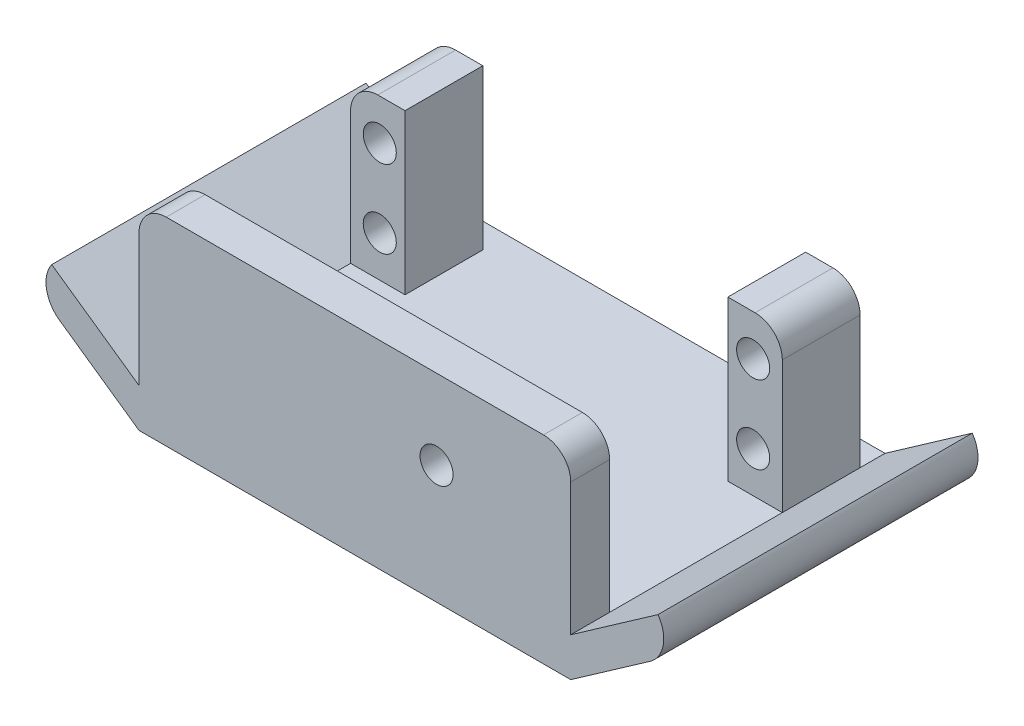
ISO-10303-21;
HEADER;
FILE_DESCRIPTION(('STEP AP214'),'2;1');
FILE_NAME('part.step','',(''),(''),'','','');
FILE_SCHEMA(('AUTOMOTIVE_DESIGN { 1 0 10303 214 1 1 1 1 }'));
ENDSEC;
DATA;
#1=APPLICATION_CONTEXT('core data for automotive mechanical design processes');
#2=APPLICATION_PROTOCOL_DEFINITION('international standard','automotive_design',2000,#1);
#3=PRODUCT_CONTEXT('',#1,'mechanical');
#4=PRODUCT('Part','Part','',(#3));
#5=PRODUCT_RELATED_PRODUCT_CATEGORY('part','',(#4));
#6=PRODUCT_DEFINITION_FORMATION('','',#4);
#7=PRODUCT_DEFINITION_CONTEXT('part definition',#1,'design');
#8=PRODUCT_DEFINITION('design','',#6,#7);
#9=PRODUCT_DEFINITION_SHAPE('','',#8);
#10=(LENGTH_UNIT() NAMED_UNIT(*) SI_UNIT(.MILLI.,.METRE.));
#11=(NAMED_UNIT(*) PLANE_ANGLE_UNIT() SI_UNIT($,.RADIAN.));
#12=(NAMED_UNIT(*) SI_UNIT($,.STERADIAN.) SOLID_ANGLE_UNIT());
#13=UNCERTAINTY_MEASURE_WITH_UNIT(LENGTH_MEASURE(1.E-05),#10,'distance_accuracy_value','');
#14=(GEOMETRIC_REPRESENTATION_CONTEXT(3) GLOBAL_UNCERTAINTY_ASSIGNED_CONTEXT((#13)) GLOBAL_UNIT_ASSIGNED_CONTEXT((#10,
#11,#12)) REPRESENTATION_CONTEXT('',''));
#15=CARTESIAN_POINT('',(0.,0.,0.));
#16=DIRECTION('',(0.,0.,1.));
#17=DIRECTION('',(1.,0.,0.));
#18=AXIS2_PLACEMENT_3D('',#15,#16,#17);
#19=CARTESIAN_POINT('',(55.5,5.,0.));
#20=DIRECTION('',(1.,0.,0.));
#21=DIRECTION('',(0.,0.,-1.));
#22=AXIS2_PLACEMENT_3D('',#19,#20,#21);
#23=PLANE('',#22);
#24=DIRECTION('',(0.,-1.,0.));
#25=VECTOR('',#24,1.);
#26=CARTESIAN_POINT('',(55.5,0.,35.4));
#27=LINE('',#26,#25);
#28=CARTESIAN_POINT('',(55.5,22.,35.4));
#29=VERTEX_POINT('',#28);
#30=CARTESIAN_POINT('',(55.5,5.,35.4));
#31=VERTEX_POINT('',#30);
#32=EDGE_CURVE('E379',#29,#31,#27,.T.);
#33=ORIENTED_EDGE('',*,*,#32,.F.);
#34=DIRECTION('',(0.,0.,1.));
#35=VECTOR('',#34,1.);
#36=CARTESIAN_POINT('',(55.5,22.,40.4));
#37=LINE('',#36,#35);
#38=CARTESIAN_POINT('',(55.5,22.,40.4));
#39=VERTEX_POINT('',#38);
#40=EDGE_CURVE('E435',#29,#39,#37,.T.);
#41=ORIENTED_EDGE('',*,*,#40,.T.);
#42=DIRECTION('',(0.,-1.,0.));
#43=VECTOR('',#42,1.);
#44=CARTESIAN_POINT('',(55.5,5.,40.4));
#45=LINE('',#44,#43);
#46=CARTESIAN_POINT('',(55.5,5.,40.4));
#47=VERTEX_POINT('',#46);
#48=EDGE_CURVE('E405',#39,#47,#45,.T.);
#49=ORIENTED_EDGE('',*,*,#48,.T.);
#50=DIRECTION('',(0.,0.,-1.));
#51=VECTOR('',#50,1.);
#52=CARTESIAN_POINT('',(55.5,5.,57.9564078321223));
#53=LINE('',#52,#51);
#54=EDGE_CURVE('E307',#47,#31,#53,.T.);
#55=ORIENTED_EDGE('',*,*,#54,.T.);
#56=EDGE_LOOP('',(#33,#41,#49,#55));
#57=FACE_BOUND('',#56,.T.);
#58=ADVANCED_FACE('F39',(#57),#23,.T.);
#59=DIRECTION('',(0.,1.,0.));
#60=VECTOR('',#59,1.);
#61=CARTESIAN_POINT('',(55.5,25.5,3.2));
#62=LINE('',#61,#60);
#63=CARTESIAN_POINT('',(55.5,5.,3.2));
#64=VERTEX_POINT('',#63);
#65=CARTESIAN_POINT('',(55.5,22.,3.2));
#66=VERTEX_POINT('',#65);
#67=EDGE_CURVE('E203',#64,#66,#62,.T.);
#68=ORIENTED_EDGE('',*,*,#67,.T.);
#69=DIRECTION('',(0.,0.,1.));
#70=VECTOR('',#69,1.);
#71=CARTESIAN_POINT('',(55.5,22.,0.));
#72=LINE('',#71,#70);
#73=CARTESIAN_POINT('',(55.5,22.,13.2));
#74=VERTEX_POINT('',#73);
#75=EDGE_CURVE('E197',#66,#74,#72,.T.);
#76=ORIENTED_EDGE('',*,*,#75,.T.);
#77=DIRECTION('',(0.,1.,0.));
#78=VECTOR('',#77,1.);
#79=CARTESIAN_POINT('',(55.5,5.,13.2));
#80=LINE('',#79,#78);
#81=CARTESIAN_POINT('',(55.5,5.,13.2));
#82=VERTEX_POINT('',#81);
#83=EDGE_CURVE('E200',#82,#74,#80,.T.);
#84=ORIENTED_EDGE('',*,*,#83,.F.);
#85=DIRECTION('',(0.,0.,1.));
#86=VECTOR('',#85,1.);
#87=CARTESIAN_POINT('',(55.5,5.,0.));
#88=LINE('',#87,#86);
#89=EDGE_CURVE('E402',#64,#82,#88,.T.);
#90=ORIENTED_EDGE('',*,*,#89,.F.);
#91=EDGE_LOOP('',(#68,#76,#84,#90));
#92=FACE_BOUND('',#91,.T.);
#93=ADVANCED_FACE('F199',(#92),#23,.T.);
#94=CARTESIAN_POINT('',(0.,5.,0.));
#95=DIRECTION('',(-1.,0.,0.));
#96=DIRECTION('',(0.,0.,1.));
#97=AXIS2_PLACEMENT_3D('',#94,#95,#96);
#98=PLANE('',#97);
#99=DIRECTION('',(0.,0.,-1.));
#100=VECTOR('',#99,1.);
#101=CARTESIAN_POINT('',(0.,5.,57.9564078321223));
#102=LINE('',#101,#100);
#103=CARTESIAN_POINT('',(0.,5.,13.2));
#104=VERTEX_POINT('',#103);
#105=CARTESIAN_POINT('',(0.,5.,3.2));
#106=VERTEX_POINT('',#105);
#107=EDGE_CURVE('E317',#104,#106,#102,.T.);
#108=ORIENTED_EDGE('',*,*,#107,.F.);
#109=DIRECTION('',(0.,-1.,0.));
#110=VECTOR('',#109,1.);
#111=CARTESIAN_POINT('',(0.,22.,13.2));
#112=LINE('',#111,#110);
#113=CARTESIAN_POINT('',(0.,22.,13.2));
#114=VERTEX_POINT('',#113);
#115=EDGE_CURVE('E253',#114,#104,#112,.T.);
#116=ORIENTED_EDGE('',*,*,#115,.F.);
#117=DIRECTION('',(0.,0.,1.));
#118=VECTOR('',#117,1.);
#119=CARTESIAN_POINT('',(0.,22.,0.));
#120=LINE('',#119,#118);
#121=CARTESIAN_POINT('',(0.,22.,3.2));
#122=VERTEX_POINT('',#121);
#123=EDGE_CURVE('E473',#114,#122,#120,.F.);
#124=ORIENTED_EDGE('',*,*,#123,.T.);
#125=DIRECTION('',(0.,-1.,0.));
#126=VECTOR('',#125,1.);
#127=CARTESIAN_POINT('',(0.,25.5,3.2));
#128=LINE('',#127,#126);
#129=EDGE_CURVE('E356',#122,#106,#128,.T.);
#130=ORIENTED_EDGE('',*,*,#129,.T.);
#131=EDGE_LOOP('',(#108,#116,#124,#130));
#132=FACE_BOUND('',#131,.T.);
#133=ADVANCED_FACE('F494',(#132),#98,.T.);
#134=DIRECTION('',(0.,-1.,0.));
#135=VECTOR('',#134,1.);
#136=CARTESIAN_POINT('',(0.,5.,40.4));
#137=LINE('',#136,#135);
#138=CARTESIAN_POINT('',(0.,22.,40.4));
#139=VERTEX_POINT('',#138);
#140=CARTESIAN_POINT('',(0.,5.,40.4));
#141=VERTEX_POINT('',#140);
#142=EDGE_CURVE('E411',#139,#141,#137,.T.);
#143=ORIENTED_EDGE('',*,*,#142,.F.);
#144=DIRECTION('',(0.,0.,1.));
#145=VECTOR('',#144,1.);
#146=CARTESIAN_POINT('',(0.,22.,35.4));
#147=LINE('',#146,#145);
#148=CARTESIAN_POINT('',(0.,22.,35.4));
#149=VERTEX_POINT('',#148);
#150=EDGE_CURVE('E467',#139,#149,#147,.F.);
#151=ORIENTED_EDGE('',*,*,#150,.T.);
#152=DIRECTION('',(0.,1.,0.));
#153=VECTOR('',#152,1.);
#154=CARTESIAN_POINT('',(0.,0.,35.4));
#155=LINE('',#154,#153);
#156=CARTESIAN_POINT('',(0.,5.,35.4));
#157=VERTEX_POINT('',#156);
#158=EDGE_CURVE('E387',#157,#149,#155,.T.);
#159=ORIENTED_EDGE('',*,*,#158,.F.);
#160=EDGE_CURVE('E333',#141,#157,#102,.T.);
#161=ORIENTED_EDGE('',*,*,#160,.F.);
#162=EDGE_LOOP('',(#143,#151,#159,#161));
#163=FACE_BOUND('',#162,.T.);
#164=ADVANCED_FACE('F515',(#163),#98,.T.);
#165=CARTESIAN_POINT('',(0.,5.,0.));
#166=DIRECTION('',(0.,-1.,0.));
#167=DIRECTION('',(0.,0.,-1.));
#168=AXIS2_PLACEMENT_3D('',#165,#166,#167);
#169=PLANE('',#168);
#170=EDGE_CURVE('E62',#82,#31,#88,.T.);
#171=ORIENTED_EDGE('',*,*,#170,.F.);
#172=DIRECTION('',(1.,0.,0.));
#173=VECTOR('',#172,1.);
#174=CARTESIAN_POINT('',(48.5,5.,13.2));
#175=LINE('',#174,#173);
#176=CARTESIAN_POINT('',(48.5,5.,13.2));
#177=VERTEX_POINT('',#176);
#178=EDGE_CURVE('E219',#177,#82,#175,.T.);
#179=ORIENTED_EDGE('',*,*,#178,.F.);
#180=DIRECTION('',(0.,0.,1.));
#181=VECTOR('',#180,1.);
#182=CARTESIAN_POINT('',(48.5,5.,3.2));
#183=LINE('',#182,#181);
#184=CARTESIAN_POINT('',(48.5,5.,3.2));
#185=VERTEX_POINT('',#184);
#186=EDGE_CURVE('E55',#185,#177,#183,.T.);
#187=ORIENTED_EDGE('',*,*,#186,.F.);
#188=DIRECTION('',(1.,0.,0.));
#189=VECTOR('',#188,1.);
#190=CARTESIAN_POINT('',(55.5,5.,3.2));
#191=LINE('',#190,#189);
#192=EDGE_CURVE('E341',#185,#64,#191,.T.);
#193=ORIENTED_EDGE('',*,*,#192,.T.);
#194=DIRECTION('',(0.,0.,-1.));
#195=VECTOR('',#194,1.);
#196=CARTESIAN_POINT('',(55.5,5.,0.));
#197=LINE('',#196,#195);
#198=CARTESIAN_POINT('',(55.5,5.,0.));
#199=VERTEX_POINT('',#198);
#200=EDGE_CURVE('E430',#64,#199,#197,.T.);
#201=ORIENTED_EDGE('',*,*,#200,.T.);
#202=DIRECTION('',(-1.,0.,0.));
#203=VECTOR('',#202,1.);
#204=CARTESIAN_POINT('',(0.,5.,0.));
#205=LINE('',#204,#203);
#206=CARTESIAN_POINT('',(0.,5.,0.));
#207=VERTEX_POINT('',#206);
#208=EDGE_CURVE('E270',#199,#207,#205,.T.);
#209=ORIENTED_EDGE('',*,*,#208,.T.);
#210=DIRECTION('',(0.,0.,1.));
#211=VECTOR('',#210,1.);
#212=CARTESIAN_POINT('',(0.,5.,0.));
#213=LINE('',#212,#211);
#214=EDGE_CURVE('E427',#207,#106,#213,.T.);
#215=ORIENTED_EDGE('',*,*,#214,.T.);
#216=DIRECTION('',(1.,0.,0.));
#217=VECTOR('',#216,1.);
#218=CARTESIAN_POINT('',(0.,5.,3.2));
#219=LINE('',#218,#217);
#220=CARTESIAN_POINT('',(7.,5.,3.2));
#221=VERTEX_POINT('',#220);
#222=EDGE_CURVE('E368',#106,#221,#219,.T.);
#223=ORIENTED_EDGE('',*,*,#222,.T.);
#224=DIRECTION('',(0.,0.,1.));
#225=VECTOR('',#224,1.);
#226=CARTESIAN_POINT('',(7.,5.,3.2));
#227=LINE('',#226,#225);
#228=CARTESIAN_POINT('',(7.,5.,13.2));
#229=VERTEX_POINT('',#228);
#230=EDGE_CURVE('E372',#221,#229,#227,.T.);
#231=ORIENTED_EDGE('',*,*,#230,.T.);
#232=DIRECTION('',(1.,0.,0.));
#233=VECTOR('',#232,1.);
#234=CARTESIAN_POINT('',(0.,5.,13.2));
#235=LINE('',#234,#233);
#236=EDGE_CURVE('E257',#104,#229,#235,.T.);
#237=ORIENTED_EDGE('',*,*,#236,.F.);
#238=DIRECTION('',(0.,0.,-1.));
#239=VECTOR('',#238,1.);
#240=CARTESIAN_POINT('',(0.,5.,0.));
#241=LINE('',#240,#239);
#242=EDGE_CURVE('E398',#157,#104,#241,.T.);
#243=ORIENTED_EDGE('',*,*,#242,.F.);
#244=DIRECTION('',(1.,0.,0.));
#245=VECTOR('',#244,1.);
#246=CARTESIAN_POINT('',(0.,5.,35.4));
#247=LINE('',#246,#245);
#248=EDGE_CURVE('E391',#157,#31,#247,.T.);
#249=ORIENTED_EDGE('',*,*,#248,.T.);
#250=EDGE_LOOP('',(#171,#179,#187,#193,#201,#209,#215,#223,#231,#237,#243,#249));
#251=FACE_BOUND('',#250,.T.);
#252=ADVANCED_FACE('F501',(#251),#169,.F.);
#253=CARTESIAN_POINT('',(0.,0.,0.));
#254=DIRECTION('',(0.,-1.,0.));
#255=DIRECTION('',(0.,0.,-1.));
#256=AXIS2_PLACEMENT_3D('',#253,#254,#255);
#257=PLANE('',#256);
#258=DIRECTION('',(-1.,0.,0.));
#259=VECTOR('',#258,1.);
#260=CARTESIAN_POINT('',(0.,0.,0.));
#261=LINE('',#260,#259);
#262=CARTESIAN_POINT('',(55.5,0.,0.));
#263=VERTEX_POINT('',#262);
#264=CARTESIAN_POINT('',(0.,0.,0.));
#265=VERTEX_POINT('',#264);
#266=EDGE_CURVE('E267',#263,#265,#261,.T.);
#267=ORIENTED_EDGE('',*,*,#266,.F.);
#268=DIRECTION('',(0.,0.,-1.));
#269=VECTOR('',#268,1.);
#270=CARTESIAN_POINT('',(55.5,0.,0.));
#271=LINE('',#270,#269);
#272=CARTESIAN_POINT('',(55.5,0.,40.4));
#273=VERTEX_POINT('',#272);
#274=EDGE_CURVE('E431',#273,#263,#271,.T.);
#275=ORIENTED_EDGE('',*,*,#274,.F.);
#276=DIRECTION('',(-1.,0.,0.));
#277=VECTOR('',#276,1.);
#278=CARTESIAN_POINT('',(0.,0.,40.4));
#279=LINE('',#278,#277);
#280=CARTESIAN_POINT('',(0.,0.,40.4));
#281=VERTEX_POINT('',#280);
#282=EDGE_CURVE('E397',#273,#281,#279,.T.);
#283=ORIENTED_EDGE('',*,*,#282,.T.);
#284=DIRECTION('',(0.,0.,1.));
#285=VECTOR('',#284,1.);
#286=CARTESIAN_POINT('',(0.,0.,0.));
#287=LINE('',#286,#285);
#288=EDGE_CURVE('E424',#265,#281,#287,.T.);
#289=ORIENTED_EDGE('',*,*,#288,.F.);
#290=EDGE_LOOP('',(#267,#275,#283,#289));
#291=FACE_BOUND('',#290,.T.);
#292=ADVANCED_FACE('F587',(#291),#257,.T.);
#293=CARTESIAN_POINT('',(0.,0.,-57.9564078321223));
#294=DIRECTION('',(-0.573576436351041,-0.819152044288995,0.));
#295=DIRECTION('',(0.819152044288995,-0.573576436351041,0.));
#296=AXIS2_PLACEMENT_3D('',#293,#294,#295);
#297=PLANE('',#296);
#298=DIRECTION('',(-0.819152044288995,0.573576436351041,0.));
#299=VECTOR('',#298,1.);
#300=CARTESIAN_POINT('',(0.,0.,0.));
#301=LINE('',#300,#299);
#302=CARTESIAN_POINT('',(-10.2088844777185,7.14833786801052,0.));
#303=VERTEX_POINT('',#302);
#304=EDGE_CURVE('E280',#265,#303,#301,.T.);
#305=ORIENTED_EDGE('',*,*,#304,.F.);
#306=ORIENTED_EDGE('',*,*,#288,.T.);
#307=DIRECTION('',(-0.819152044288995,0.573576436351041,0.));
#308=VECTOR('',#307,1.);
#309=CARTESIAN_POINT('',(0.,0.,40.4));
#310=LINE('',#309,#308);
#311=CARTESIAN_POINT('',(-10.2088844777185,7.14833786801052,40.4));
#312=VERTEX_POINT('',#311);
#313=EDGE_CURVE('E329',#281,#312,#310,.T.);
#314=ORIENTED_EDGE('',*,*,#313,.T.);
#315=DIRECTION('',(0.,0.,1.));
#316=VECTOR('',#315,1.);
#317=CARTESIAN_POINT('',(-10.2088844777185,7.14833786801052,-57.9564078321223));
#318=LINE('',#317,#316);
#319=EDGE_CURVE('E421',#303,#312,#318,.T.);
#320=ORIENTED_EDGE('',*,*,#319,.F.);
#321=EDGE_LOOP('',(#305,#306,#314,#320));
#322=FACE_BOUND('',#321,.T.);
#323=ADVANCED_FACE('F583',(#322),#297,.T.);
#324=CARTESIAN_POINT('',(-7.85722108643022,10.5068612528074,-57.9564078321223));
#325=DIRECTION('',(0.,0.,1.));
#326=DIRECTION('',(1.,0.,0.));
#327=AXIS2_PLACEMENT_3D('',#324,#325,#326);
#328=CYLINDRICAL_SURFACE('',#327,4.10000000392109);
#329=CARTESIAN_POINT('',(-7.85722108643022,10.5068612528074,0.));
#330=DIRECTION('',(0.,0.,1.));
#331=DIRECTION('',(1.,0.,0.));
#332=AXIS2_PLACEMENT_3D('',#329,#330,#331);
#333=CIRCLE('',#332,4.10000000392109);
#334=CARTESIAN_POINT('',(-11.2181745148335,12.8550503602383,0.));
#335=VERTEX_POINT('',#334);
#336=EDGE_CURVE('E277',#303,#335,#333,.F.);
#337=ORIENTED_EDGE('',*,*,#336,.F.);
#338=ORIENTED_EDGE('',*,*,#319,.T.);
#339=CARTESIAN_POINT('',(-7.85722108643022,10.5068612528074,40.4));
#340=DIRECTION('',(0.,0.,-1.));
#341=DIRECTION('',(-1.,0.,0.));
#342=AXIS2_PLACEMENT_3D('',#339,#340,#341);
#343=CIRCLE('',#342,4.10000000392109);
#344=CARTESIAN_POINT('',(-11.2181745148335,12.8550503602383,40.4));
#345=VERTEX_POINT('',#344);
#346=EDGE_CURVE('E324',#312,#345,#343,.T.);
#347=ORIENTED_EDGE('',*,*,#346,.T.);
#348=DIRECTION('',(0.,0.,1.));
#349=VECTOR('',#348,1.);
#350=CARTESIAN_POINT('',(-11.2181745148335,12.8550503602383,-57.9564078321223));
#351=LINE('',#350,#349);
#352=EDGE_CURVE('E418',#335,#345,#351,.T.);
#353=ORIENTED_EDGE('',*,*,#352,.F.);
#354=EDGE_LOOP('',(#337,#338,#347,#353));
#355=FACE_BOUND('',#354,.T.);
#356=ADVANCED_FACE('F586',(#355),#328,.T.);
#357=CARTESIAN_POINT('',(0.,5.,-57.9564078321223));
#358=DIRECTION('',(0.573576436351041,0.819152044288995,0.));
#359=DIRECTION('',(-0.819152044288995,0.573576436351041,0.));
#360=AXIS2_PLACEMENT_3D('',#357,#358,#359);
#361=PLANE('',#360);
#362=DIRECTION('',(0.819152044288995,-0.573576436351041,0.));
#363=VECTOR('',#362,1.);
#364=CARTESIAN_POINT('',(0.,5.,0.));
#365=LINE('',#364,#363);
#366=EDGE_CURVE('E274',#335,#207,#365,.T.);
#367=ORIENTED_EDGE('',*,*,#366,.F.);
#368=ORIENTED_EDGE('',*,*,#352,.T.);
#369=DIRECTION('',(0.819152044288995,-0.573576436351041,0.));
#370=VECTOR('',#369,1.);
#371=CARTESIAN_POINT('',(0.,5.,40.4));
#372=LINE('',#371,#370);
#373=EDGE_CURVE('E328',#345,#141,#372,.T.);
#374=ORIENTED_EDGE('',*,*,#373,.T.);
#375=ORIENTED_EDGE('',*,*,#160,.T.);
#376=ORIENTED_EDGE('',*,*,#242,.T.);
#377=ORIENTED_EDGE('',*,*,#107,.T.);
#378=ORIENTED_EDGE('',*,*,#214,.F.);
#379=EDGE_LOOP('',(#367,#368,#374,#375,#376,#377,#378));
#380=FACE_BOUND('',#379,.T.);
#381=ADVANCED_FACE('F504',(#380),#361,.T.);
#382=CARTESIAN_POINT('',(55.5,5.,-57.9564078321223));
#383=DIRECTION('',(-0.573576436351041,0.819152044288995,0.));
#384=DIRECTION('',(-0.819152044288995,-0.573576436351041,0.));
#385=AXIS2_PLACEMENT_3D('',#382,#383,#384);
#386=PLANE('',#385);
#387=DIRECTION('',(0.819152044288995,0.573576436351041,0.));
#388=VECTOR('',#387,1.);
#389=CARTESIAN_POINT('',(55.5,5.,0.));
#390=LINE('',#389,#388);
#391=CARTESIAN_POINT('',(66.7181745148335,12.8550503602383,0.));
#392=VERTEX_POINT('',#391);
#393=EDGE_CURVE('E264',#199,#392,#390,.T.);
#394=ORIENTED_EDGE('',*,*,#393,.F.);
#395=ORIENTED_EDGE('',*,*,#200,.F.);
#396=ORIENTED_EDGE('',*,*,#89,.T.);
#397=ORIENTED_EDGE('',*,*,#170,.T.);
#398=ORIENTED_EDGE('',*,*,#54,.F.);
#399=DIRECTION('',(0.819152044288995,0.573576436351041,0.));
#400=VECTOR('',#399,1.);
#401=CARTESIAN_POINT('',(55.5,5.,40.4));
#402=LINE('',#401,#400);
#403=CARTESIAN_POINT('',(66.7181745148335,12.8550503602383,40.4));
#404=VERTEX_POINT('',#403);
#405=EDGE_CURVE('E313',#47,#404,#402,.T.);
#406=ORIENTED_EDGE('',*,*,#405,.T.);
#407=DIRECTION('',(0.,0.,1.));
#408=VECTOR('',#407,1.);
#409=CARTESIAN_POINT('',(66.7181745148335,12.8550503602383,-57.9564078321223));
#410=LINE('',#409,#408);
#411=EDGE_CURVE('E415',#392,#404,#410,.T.);
#412=ORIENTED_EDGE('',*,*,#411,.F.);
#413=EDGE_LOOP('',(#394,#395,#396,#397,#398,#406,#412));
#414=FACE_BOUND('',#413,.T.);
#415=ADVANCED_FACE('F535',(#414),#386,.T.);
#416=CARTESIAN_POINT('',(63.3572210864302,10.5068612528074,-57.9564078321223));
#417=DIRECTION('',(0.,0.,1.));
#418=DIRECTION('',(1.,0.,0.));
#419=AXIS2_PLACEMENT_3D('',#416,#417,#418);
#420=CYLINDRICAL_SURFACE('',#419,4.10000000392109);
#421=CARTESIAN_POINT('',(63.3572210864302,10.5068612528074,0.));
#422=DIRECTION('',(0.,0.,1.));
#423=DIRECTION('',(1.,0.,0.));
#424=AXIS2_PLACEMENT_3D('',#421,#422,#423);
#425=CIRCLE('',#424,4.10000000392109);
#426=CARTESIAN_POINT('',(65.7088844777185,7.14833786801052,0.));
#427=VERTEX_POINT('',#426);
#428=EDGE_CURVE('E261',#392,#427,#425,.F.);
#429=ORIENTED_EDGE('',*,*,#428,.F.);
#430=ORIENTED_EDGE('',*,*,#411,.T.);
#431=CARTESIAN_POINT('',(63.3572210864302,10.5068612528074,40.4));
#432=DIRECTION('',(0.,0.,-1.));
#433=DIRECTION('',(-1.,0.,0.));
#434=AXIS2_PLACEMENT_3D('',#431,#432,#433);
#435=CIRCLE('',#434,4.10000000392109);
#436=CARTESIAN_POINT('',(65.7088844777185,7.14833786801052,40.4));
#437=VERTEX_POINT('',#436);
#438=EDGE_CURVE('E308',#404,#437,#435,.T.);
#439=ORIENTED_EDGE('',*,*,#438,.T.);
#440=DIRECTION('',(0.,0.,1.));
#441=VECTOR('',#440,1.);
#442=CARTESIAN_POINT('',(65.7088844777185,7.14833786801052,-57.9564078321223));
#443=LINE('',#442,#441);
#444=EDGE_CURVE('E414',#427,#437,#443,.T.);
#445=ORIENTED_EDGE('',*,*,#444,.F.);
#446=EDGE_LOOP('',(#429,#430,#439,#445));
#447=FACE_BOUND('',#446,.T.);
#448=ADVANCED_FACE('F576',(#447),#420,.T.);
#449=CARTESIAN_POINT('',(55.5,0.,-57.9564078321223));
#450=DIRECTION('',(0.573576436351042,-0.819152044288995,0.));
#451=DIRECTION('',(0.819152044288995,0.573576436351042,0.));
#452=AXIS2_PLACEMENT_3D('',#449,#450,#451);
#453=PLANE('',#452);
#454=DIRECTION('',(-0.819152044288995,-0.573576436351042,0.));
#455=VECTOR('',#454,1.);
#456=CARTESIAN_POINT('',(55.5,0.,0.));
#457=LINE('',#456,#455);
#458=EDGE_CURVE('E11',#427,#263,#457,.T.);
#459=ORIENTED_EDGE('',*,*,#458,.F.);
#460=ORIENTED_EDGE('',*,*,#444,.T.);
#461=DIRECTION('',(-0.819152044288995,-0.573576436351042,0.));
#462=VECTOR('',#461,1.);
#463=CARTESIAN_POINT('',(55.5,0.,40.4));
#464=LINE('',#463,#462);
#465=EDGE_CURVE('E312',#437,#273,#464,.T.);
#466=ORIENTED_EDGE('',*,*,#465,.T.);
#467=ORIENTED_EDGE('',*,*,#274,.T.);
#468=EDGE_LOOP('',(#459,#460,#466,#467));
#469=FACE_BOUND('',#468,.T.);
#470=ADVANCED_FACE('F570',(#469),#453,.T.);
#471=CARTESIAN_POINT('',(0.,5.,40.4));
#472=DIRECTION('',(0.,0.,1.));
#473=DIRECTION('',(1.,0.,0.));
#474=AXIS2_PLACEMENT_3D('',#471,#472,#473);
#475=PLANE('',#474);
#476=CARTESIAN_POINT('',(38.25,15.25,40.4));
#477=DIRECTION('',(0.,0.,1.));
#478=DIRECTION('',(1.,0.,0.));
#479=AXIS2_PLACEMENT_3D('',#476,#477,#478);
#480=CIRCLE('',#479,2.125);
#481=CARTESIAN_POINT('',(40.375,15.25,40.4));
#482=VERTEX_POINT('',#481);
#483=EDGE_CURVE('E284',#482,#482,#480,.T.);
#484=ORIENTED_EDGE('',*,*,#483,.F.);
#485=EDGE_LOOP('',(#484));
#486=FACE_BOUND('',#485,.T.);
#487=ORIENTED_EDGE('',*,*,#48,.F.);
#488=CARTESIAN_POINT('',(52.,22.,40.4));
#489=DIRECTION('',(0.,0.,1.));
#490=DIRECTION('',(1.,0.,0.));
#491=AXIS2_PLACEMENT_3D('',#488,#489,#490);
#492=CIRCLE('',#491,3.5);
#493=CARTESIAN_POINT('',(52.,25.5,40.4));
#494=VERTEX_POINT('',#493);
#495=EDGE_CURVE('E447',#39,#494,#492,.T.);
#496=ORIENTED_EDGE('',*,*,#495,.T.);
#497=DIRECTION('',(1.,0.,0.));
#498=VECTOR('',#497,1.);
#499=CARTESIAN_POINT('',(55.5,25.5,40.4));
#500=LINE('',#499,#498);
#501=CARTESIAN_POINT('',(3.5,25.5,40.4));
#502=VERTEX_POINT('',#501);
#503=EDGE_CURVE('E378',#502,#494,#500,.T.);
#504=ORIENTED_EDGE('',*,*,#503,.F.);
#505=CARTESIAN_POINT('',(3.5,22.,40.4));
#506=DIRECTION('',(0.,0.,1.));
#507=DIRECTION('',(1.,0.,0.));
#508=AXIS2_PLACEMENT_3D('',#505,#506,#507);
#509=CIRCLE('',#508,3.5);
#510=EDGE_CURVE('E444',#502,#139,#509,.T.);
#511=ORIENTED_EDGE('',*,*,#510,.T.);
#512=ORIENTED_EDGE('',*,*,#142,.T.);
#513=ORIENTED_EDGE('',*,*,#373,.F.);
#514=ORIENTED_EDGE('',*,*,#346,.F.);
#515=ORIENTED_EDGE('',*,*,#313,.F.);
#516=ORIENTED_EDGE('',*,*,#282,.F.);
#517=ORIENTED_EDGE('',*,*,#465,.F.);
#518=ORIENTED_EDGE('',*,*,#438,.F.);
#519=ORIENTED_EDGE('',*,*,#405,.F.);
#520=EDGE_LOOP('',(#487,#496,#504,#511,#512,#513,#514,#515,#516,#517,#518,#519));
#521=FACE_BOUND('',#520,.T.);
#522=ADVANCED_FACE('F567',(#486,#521),#475,.T.);
#523=CARTESIAN_POINT('',(0.,0.,35.4));
#524=DIRECTION('',(0.,0.,-1.));
#525=DIRECTION('',(1.,0.,0.));
#526=AXIS2_PLACEMENT_3D('',#523,#524,#525);
#527=PLANE('',#526);
#528=CARTESIAN_POINT('',(38.25,15.25,35.4));
#529=DIRECTION('',(0.,0.,1.));
#530=DIRECTION('',(1.,0.,0.));
#531=AXIS2_PLACEMENT_3D('',#528,#529,#530);
#532=CIRCLE('',#531,2.125);
#533=CARTESIAN_POINT('',(40.375,15.25,35.4));
#534=VERTEX_POINT('',#533);
#535=EDGE_CURVE('E283',#534,#534,#532,.T.);
#536=ORIENTED_EDGE('',*,*,#535,.T.);
#537=EDGE_LOOP('',(#536));
#538=FACE_BOUND('',#537,.T.);
#539=DIRECTION('',(1.,0.,0.));
#540=VECTOR('',#539,1.);
#541=CARTESIAN_POINT('',(55.5,25.5,35.4));
#542=LINE('',#541,#540);
#543=CARTESIAN_POINT('',(3.5,25.5,35.4));
#544=VERTEX_POINT('',#543);
#545=CARTESIAN_POINT('',(52.,25.5,35.4));
#546=VERTEX_POINT('',#545);
#547=EDGE_CURVE('E383',#544,#546,#542,.T.);
#548=ORIENTED_EDGE('',*,*,#547,.T.);
#549=CARTESIAN_POINT('',(52.,22.,35.4));
#550=DIRECTION('',(0.,0.,-1.));
#551=DIRECTION('',(-1.,0.,0.));
#552=AXIS2_PLACEMENT_3D('',#549,#550,#551);
#553=CIRCLE('',#552,3.5);
#554=EDGE_CURVE('E209',#546,#29,#553,.T.);
#555=ORIENTED_EDGE('',*,*,#554,.T.);
#556=ORIENTED_EDGE('',*,*,#32,.T.);
#557=ORIENTED_EDGE('',*,*,#248,.F.);
#558=ORIENTED_EDGE('',*,*,#158,.T.);
#559=CARTESIAN_POINT('',(3.5,22.,35.4));
#560=DIRECTION('',(0.,0.,-1.));
#561=DIRECTION('',(-1.,0.,0.));
#562=AXIS2_PLACEMENT_3D('',#559,#560,#561);
#563=CIRCLE('',#562,3.5);
#564=EDGE_CURVE('E457',#149,#544,#563,.T.);
#565=ORIENTED_EDGE('',*,*,#564,.T.);
#566=EDGE_LOOP('',(#548,#555,#556,#557,#558,#565));
#567=FACE_BOUND('',#566,.T.);
#568=ADVANCED_FACE('F512',(#538,#567),#527,.T.);
#569=CARTESIAN_POINT('',(55.5,25.5,35.4));
#570=DIRECTION('',(0.,-1.,0.));
#571=DIRECTION('',(0.,0.,-1.));
#572=AXIS2_PLACEMENT_3D('',#569,#570,#571);
#573=PLANE('',#572);
#574=ORIENTED_EDGE('',*,*,#503,.T.);
#575=DIRECTION('',(0.,0.,1.));
#576=VECTOR('',#575,1.);
#577=CARTESIAN_POINT('',(52.,25.5,35.4));
#578=LINE('',#577,#576);
#579=EDGE_CURVE('E454',#494,#546,#578,.F.);
#580=ORIENTED_EDGE('',*,*,#579,.T.);
#581=ORIENTED_EDGE('',*,*,#547,.F.);
#582=DIRECTION('',(0.,0.,1.));
#583=VECTOR('',#582,1.);
#584=CARTESIAN_POINT('',(3.5,25.5,40.4));
#585=LINE('',#584,#583);
#586=EDGE_CURVE('E450',#544,#502,#585,.T.);
#587=ORIENTED_EDGE('',*,*,#586,.T.);
#588=EDGE_LOOP('',(#574,#580,#581,#587));
#589=FACE_BOUND('',#588,.T.);
#590=ADVANCED_FACE('F523',(#589),#573,.F.);
#591=CARTESIAN_POINT('',(0.,25.5,3.2));
#592=DIRECTION('',(0.,1.,0.));
#593=DIRECTION('',(0.,0.,1.));
#594=AXIS2_PLACEMENT_3D('',#591,#592,#593);
#595=PLANE('',#594);
#596=DIRECTION('',(-1.,0.,0.));
#597=VECTOR('',#596,1.);
#598=CARTESIAN_POINT('',(0.,25.5,3.2));
#599=LINE('',#598,#597);
#600=CARTESIAN_POINT('',(7.,25.5,3.2));
#601=VERTEX_POINT('',#600);
#602=CARTESIAN_POINT('',(3.5,25.5,3.2));
#603=VERTEX_POINT('',#602);
#604=EDGE_CURVE('E360',#601,#603,#599,.T.);
#605=ORIENTED_EDGE('',*,*,#604,.T.);
#606=DIRECTION('',(0.,0.,1.));
#607=VECTOR('',#606,1.);
#608=CARTESIAN_POINT('',(3.5,25.5,3.2));
#609=LINE('',#608,#607);
#610=CARTESIAN_POINT('',(3.5,25.5,13.2));
#611=VERTEX_POINT('',#610);
#612=EDGE_CURVE('E470',#603,#611,#609,.T.);
#613=ORIENTED_EDGE('',*,*,#612,.T.);
#614=DIRECTION('',(-1.,0.,0.));
#615=VECTOR('',#614,1.);
#616=CARTESIAN_POINT('',(7.,25.5,13.2));
#617=LINE('',#616,#615);
#618=CARTESIAN_POINT('',(7.,25.5,13.2));
#619=VERTEX_POINT('',#618);
#620=EDGE_CURVE('E245',#619,#611,#617,.T.);
#621=ORIENTED_EDGE('',*,*,#620,.F.);
#622=DIRECTION('',(0.,0.,1.));
#623=VECTOR('',#622,1.);
#624=CARTESIAN_POINT('',(7.,25.5,3.2));
#625=LINE('',#624,#623);
#626=EDGE_CURVE('E375',#601,#619,#625,.T.);
#627=ORIENTED_EDGE('',*,*,#626,.F.);
#628=EDGE_LOOP('',(#605,#613,#621,#627));
#629=FACE_BOUND('',#628,.T.);
#630=ADVANCED_FACE('F486',(#629),#595,.T.);
#631=CARTESIAN_POINT('',(7.,25.5,3.2));
#632=DIRECTION('',(1.,0.,0.));
#633=DIRECTION('',(0.,1.,0.));
#634=AXIS2_PLACEMENT_3D('',#631,#632,#633);
#635=PLANE('',#634);
#636=ORIENTED_EDGE('',*,*,#626,.T.);
#637=DIRECTION('',(0.,1.,0.));
#638=VECTOR('',#637,1.);
#639=CARTESIAN_POINT('',(7.,5.,13.2));
#640=LINE('',#639,#638);
#641=EDGE_CURVE('E241',#229,#619,#640,.T.);
#642=ORIENTED_EDGE('',*,*,#641,.F.);
#643=ORIENTED_EDGE('',*,*,#230,.F.);
#644=DIRECTION('',(0.,1.,0.));
#645=VECTOR('',#644,1.);
#646=CARTESIAN_POINT('',(7.,25.5,3.2));
#647=LINE('',#646,#645);
#648=EDGE_CURVE('E364',#221,#601,#647,.T.);
#649=ORIENTED_EDGE('',*,*,#648,.T.);
#650=EDGE_LOOP('',(#636,#642,#643,#649));
#651=FACE_BOUND('',#650,.T.);
#652=ADVANCED_FACE('F721',(#651),#635,.T.);
#653=CARTESIAN_POINT('',(0.,0.,3.2));
#654=DIRECTION('',(0.,0.,-1.));
#655=DIRECTION('',(1.,0.,0.));
#656=AXIS2_PLACEMENT_3D('',#653,#654,#655);
#657=PLANE('',#656);
#658=CARTESIAN_POINT('',(3.75,10.25,3.2));
#659=DIRECTION('',(0.,0.,1.));
#660=DIRECTION('',(-1.,0.,0.));
#661=AXIS2_PLACEMENT_3D('',#658,#659,#660);
#662=CIRCLE('',#661,2.125);
#663=CARTESIAN_POINT('',(1.625,10.25,3.2));
#664=VERTEX_POINT('',#663);
#665=EDGE_CURVE('E292',#664,#664,#662,.T.);
#666=ORIENTED_EDGE('',*,*,#665,.T.);
#667=EDGE_LOOP('',(#666));
#668=FACE_BOUND('',#667,.T.);
#669=CARTESIAN_POINT('',(3.75,20.25,3.2));
#670=DIRECTION('',(0.,0.,1.));
#671=DIRECTION('',(1.,0.,0.));
#672=AXIS2_PLACEMENT_3D('',#669,#670,#671);
#673=CIRCLE('',#672,2.125);
#674=CARTESIAN_POINT('',(5.875,20.25,3.2));
#675=VERTEX_POINT('',#674);
#676=EDGE_CURVE('E296',#675,#675,#673,.T.);
#677=ORIENTED_EDGE('',*,*,#676,.T.);
#678=EDGE_LOOP('',(#677));
#679=FACE_BOUND('',#678,.T.);
#680=ORIENTED_EDGE('',*,*,#129,.F.);
#681=CARTESIAN_POINT('',(3.5,22.,3.2));
#682=DIRECTION('',(0.,0.,-1.));
#683=DIRECTION('',(-1.,0.,0.));
#684=AXIS2_PLACEMENT_3D('',#681,#682,#683);
#685=CIRCLE('',#684,3.5);
#686=EDGE_CURVE('E48',#122,#603,#685,.T.);
#687=ORIENTED_EDGE('',*,*,#686,.T.);
#688=ORIENTED_EDGE('',*,*,#604,.F.);
#689=ORIENTED_EDGE('',*,*,#648,.F.);
#690=ORIENTED_EDGE('',*,*,#222,.F.);
#691=EDGE_LOOP('',(#680,#687,#688,#689,#690));
#692=FACE_BOUND('',#691,.T.);
#693=ADVANCED_FACE('F480',(#668,#679,#692),#657,.T.);
#694=CARTESIAN_POINT('',(48.5,25.5,3.2));
#695=DIRECTION('',(-1.,0.,0.));
#696=DIRECTION('',(0.,-1.,0.));
#697=AXIS2_PLACEMENT_3D('',#694,#695,#696);
#698=PLANE('',#697);
#699=ORIENTED_EDGE('',*,*,#186,.T.);
#700=DIRECTION('',(0.,-1.,0.));
#701=VECTOR('',#700,1.);
#702=CARTESIAN_POINT('',(48.5,25.5,13.2));
#703=LINE('',#702,#701);
#704=CARTESIAN_POINT('',(48.5,25.5,13.2));
#705=VERTEX_POINT('',#704);
#706=EDGE_CURVE('E227',#705,#177,#703,.T.);
#707=ORIENTED_EDGE('',*,*,#706,.F.);
#708=DIRECTION('',(0.,0.,1.));
#709=VECTOR('',#708,1.);
#710=CARTESIAN_POINT('',(48.5,25.5,3.2));
#711=LINE('',#710,#709);
#712=CARTESIAN_POINT('',(48.5,25.5,3.2));
#713=VERTEX_POINT('',#712);
#714=EDGE_CURVE('E351',#713,#705,#711,.T.);
#715=ORIENTED_EDGE('',*,*,#714,.F.);
#716=DIRECTION('',(0.,-1.,0.));
#717=VECTOR('',#716,1.);
#718=CARTESIAN_POINT('',(48.5,25.5,3.2));
#719=LINE('',#718,#717);
#720=EDGE_CURVE('E345',#713,#185,#719,.T.);
#721=ORIENTED_EDGE('',*,*,#720,.T.);
#722=EDGE_LOOP('',(#699,#707,#715,#721));
#723=FACE_BOUND('',#722,.T.);
#724=ADVANCED_FACE('F546',(#723),#698,.T.);
#725=CARTESIAN_POINT('',(55.5,25.5,3.2));
#726=DIRECTION('',(0.,1.,0.));
#727=DIRECTION('',(0.,0.,1.));
#728=AXIS2_PLACEMENT_3D('',#725,#726,#727);
#729=PLANE('',#728);
#730=ORIENTED_EDGE('',*,*,#714,.T.);
#731=DIRECTION('',(-1.,0.,0.));
#732=VECTOR('',#731,1.);
#733=CARTESIAN_POINT('',(52.,25.5,13.2));
#734=LINE('',#733,#732);
#735=CARTESIAN_POINT('',(52.,25.5,13.2));
#736=VERTEX_POINT('',#735);
#737=EDGE_CURVE('E224',#736,#705,#734,.T.);
#738=ORIENTED_EDGE('',*,*,#737,.F.);
#739=DIRECTION('',(0.,0.,1.));
#740=VECTOR('',#739,1.);
#741=CARTESIAN_POINT('',(52.,25.5,3.2));
#742=LINE('',#741,#740);
#743=CARTESIAN_POINT('',(52.,25.5,3.2));
#744=VERTEX_POINT('',#743);
#745=EDGE_CURVE('E208',#736,#744,#742,.F.);
#746=ORIENTED_EDGE('',*,*,#745,.T.);
#747=DIRECTION('',(-1.,0.,0.));
#748=VECTOR('',#747,1.);
#749=CARTESIAN_POINT('',(55.5,25.5,3.2));
#750=LINE('',#749,#748);
#751=EDGE_CURVE('E348',#744,#713,#750,.T.);
#752=ORIENTED_EDGE('',*,*,#751,.T.);
#753=EDGE_LOOP('',(#730,#738,#746,#752));
#754=FACE_BOUND('',#753,.T.);
#755=ADVANCED_FACE('F548',(#754),#729,.T.);
#756=CARTESIAN_POINT('',(0.,0.,3.2));
#757=DIRECTION('',(0.,0.,1.));
#758=DIRECTION('',(-1.,0.,0.));
#759=AXIS2_PLACEMENT_3D('',#756,#757,#758);
#760=PLANE('',#759);
#761=CARTESIAN_POINT('',(51.75,20.25,3.2));
#762=DIRECTION('',(0.,0.,1.));
#763=DIRECTION('',(-1.,0.,0.));
#764=AXIS2_PLACEMENT_3D('',#761,#762,#763);
#765=CIRCLE('',#764,2.125);
#766=CARTESIAN_POINT('',(49.625,20.25,3.2));
#767=VERTEX_POINT('',#766);
#768=EDGE_CURVE('E288',#767,#767,#765,.T.);
#769=ORIENTED_EDGE('',*,*,#768,.T.);
#770=EDGE_LOOP('',(#769));
#771=FACE_BOUND('',#770,.T.);
#772=CARTESIAN_POINT('',(51.75,10.25,3.2));
#773=DIRECTION('',(0.,0.,1.));
#774=DIRECTION('',(1.,0.,0.));
#775=AXIS2_PLACEMENT_3D('',#772,#773,#774);
#776=CIRCLE('',#775,2.125);
#777=CARTESIAN_POINT('',(53.875,10.25,3.2));
#778=VERTEX_POINT('',#777);
#779=EDGE_CURVE('E297',#778,#778,#776,.T.);
#780=ORIENTED_EDGE('',*,*,#779,.T.);
#781=EDGE_LOOP('',(#780));
#782=FACE_BOUND('',#781,.T.);
#783=ORIENTED_EDGE('',*,*,#751,.F.);
#784=CARTESIAN_POINT('',(52.,22.,3.2));
#785=DIRECTION('',(0.,0.,1.));
#786=DIRECTION('',(1.,0.,0.));
#787=AXIS2_PLACEMENT_3D('',#784,#785,#786);
#788=CIRCLE('',#787,3.5);
#789=EDGE_CURVE('E464',#744,#66,#788,.F.);
#790=ORIENTED_EDGE('',*,*,#789,.T.);
#791=ORIENTED_EDGE('',*,*,#67,.F.);
#792=ORIENTED_EDGE('',*,*,#192,.F.);
#793=ORIENTED_EDGE('',*,*,#720,.F.);
#794=EDGE_LOOP('',(#783,#790,#791,#792,#793));
#795=FACE_BOUND('',#794,.T.);
#796=ADVANCED_FACE('F541',(#771,#782,#795),#760,.F.);
#797=CARTESIAN_POINT('',(51.75,10.25,8.2));
#798=DIRECTION('',(0.,0.,-1.));
#799=DIRECTION('',(-1.,0.,0.));
#800=AXIS2_PLACEMENT_3D('',#797,#798,#799);
#801=CYLINDRICAL_SURFACE('',#800,2.125);
#802=ORIENTED_EDGE('',*,*,#779,.F.);
#803=EDGE_LOOP('',(#802));
#804=FACE_BOUND('',#803,.T.);
#805=CARTESIAN_POINT('',(51.75,10.25,13.2));
#806=DIRECTION('',(0.,0.,1.));
#807=DIRECTION('',(1.,0.,0.));
#808=AXIS2_PLACEMENT_3D('',#805,#806,#807);
#809=CIRCLE('',#808,2.125);
#810=CARTESIAN_POINT('',(53.875,10.25,13.2));
#811=VERTEX_POINT('',#810);
#812=EDGE_CURVE('E653',#811,#811,#809,.T.);
#813=ORIENTED_EDGE('',*,*,#812,.T.);
#814=EDGE_LOOP('',(#813));
#815=FACE_BOUND('',#814,.T.);
#816=ADVANCED_FACE('F555',(#804,#815),#801,.F.);
#817=CARTESIAN_POINT('',(51.75,20.25,8.2));
#818=DIRECTION('',(0.,0.,-1.));
#819=DIRECTION('',(-1.,0.,0.));
#820=AXIS2_PLACEMENT_3D('',#817,#818,#819);
#821=CYLINDRICAL_SURFACE('',#820,2.125);
#822=ORIENTED_EDGE('',*,*,#768,.F.);
#823=EDGE_LOOP('',(#822));
#824=FACE_BOUND('',#823,.T.);
#825=CARTESIAN_POINT('',(51.75,20.25,13.2));
#826=DIRECTION('',(0.,0.,1.));
#827=DIRECTION('',(1.,0.,0.));
#828=AXIS2_PLACEMENT_3D('',#825,#826,#827);
#829=CIRCLE('',#828,2.125);
#830=CARTESIAN_POINT('',(53.875,20.25,13.2));
#831=VERTEX_POINT('',#830);
#832=EDGE_CURVE('E544',#831,#831,#829,.T.);
#833=ORIENTED_EDGE('',*,*,#832,.T.);
#834=EDGE_LOOP('',(#833));
#835=FACE_BOUND('',#834,.T.);
#836=ADVANCED_FACE('F628',(#824,#835),#821,.F.);
#837=CARTESIAN_POINT('',(3.75,20.25,8.2));
#838=DIRECTION('',(0.,0.,-1.));
#839=DIRECTION('',(-1.,0.,0.));
#840=AXIS2_PLACEMENT_3D('',#837,#838,#839);
#841=CYLINDRICAL_SURFACE('',#840,2.125);
#842=ORIENTED_EDGE('',*,*,#676,.F.);
#843=EDGE_LOOP('',(#842));
#844=FACE_BOUND('',#843,.T.);
#845=CARTESIAN_POINT('',(3.75,20.25,13.2));
#846=DIRECTION('',(0.,0.,1.));
#847=DIRECTION('',(1.,0.,0.));
#848=AXIS2_PLACEMENT_3D('',#845,#846,#847);
#849=CIRCLE('',#848,2.125);
#850=CARTESIAN_POINT('',(5.875,20.25,13.2));
#851=VERTEX_POINT('',#850);
#852=EDGE_CURVE('E237',#851,#851,#849,.T.);
#853=ORIENTED_EDGE('',*,*,#852,.T.);
#854=EDGE_LOOP('',(#853));
#855=FACE_BOUND('',#854,.T.);
#856=ADVANCED_FACE('F624',(#844,#855),#841,.F.);
#857=CARTESIAN_POINT('',(3.75,10.25,8.2));
#858=DIRECTION('',(0.,0.,-1.));
#859=DIRECTION('',(-1.,0.,0.));
#860=AXIS2_PLACEMENT_3D('',#857,#858,#859);
#861=CYLINDRICAL_SURFACE('',#860,2.125);
#862=ORIENTED_EDGE('',*,*,#665,.F.);
#863=EDGE_LOOP('',(#862));
#864=FACE_BOUND('',#863,.T.);
#865=CARTESIAN_POINT('',(3.75,10.25,13.2));
#866=DIRECTION('',(0.,0.,1.));
#867=DIRECTION('',(1.,0.,0.));
#868=AXIS2_PLACEMENT_3D('',#865,#866,#867);
#869=CIRCLE('',#868,2.125);
#870=CARTESIAN_POINT('',(5.875,10.25,13.2));
#871=VERTEX_POINT('',#870);
#872=EDGE_CURVE('E233',#871,#871,#869,.T.);
#873=ORIENTED_EDGE('',*,*,#872,.T.);
#874=EDGE_LOOP('',(#873));
#875=FACE_BOUND('',#874,.T.);
#876=ADVANCED_FACE('F601',(#864,#875),#861,.F.);
#877=CARTESIAN_POINT('',(52.,22.,0.));
#878=DIRECTION('',(0.,0.,-1.));
#879=DIRECTION('',(-1.,0.,0.));
#880=AXIS2_PLACEMENT_3D('',#877,#878,#879);
#881=CYLINDRICAL_SURFACE('',#880,3.5);
#882=ORIENTED_EDGE('',*,*,#554,.F.);
#883=ORIENTED_EDGE('',*,*,#579,.F.);
#884=ORIENTED_EDGE('',*,*,#495,.F.);
#885=ORIENTED_EDGE('',*,*,#40,.F.);
#886=EDGE_LOOP('',(#882,#883,#884,#885));
#887=FACE_BOUND('',#886,.T.);
#888=ADVANCED_FACE('F527',(#887),#881,.T.);
#889=CARTESIAN_POINT('',(52.,22.,0.));
#890=DIRECTION('',(0.,0.,1.));
#891=DIRECTION('',(1.,0.,0.));
#892=AXIS2_PLACEMENT_3D('',#889,#890,#891);
#893=CYLINDRICAL_SURFACE('',#892,3.5);
#894=ORIENTED_EDGE('',*,*,#789,.F.);
#895=ORIENTED_EDGE('',*,*,#745,.F.);
#896=CARTESIAN_POINT('',(52.,22.,13.2));
#897=DIRECTION('',(0.,0.,1.));
#898=DIRECTION('',(1.,0.,0.));
#899=AXIS2_PLACEMENT_3D('',#896,#897,#898);
#900=CIRCLE('',#899,3.5);
#901=EDGE_CURVE('E216',#74,#736,#900,.T.);
#902=ORIENTED_EDGE('',*,*,#901,.F.);
#903=ORIENTED_EDGE('',*,*,#75,.F.);
#904=EDGE_LOOP('',(#894,#895,#902,#903));
#905=FACE_BOUND('',#904,.T.);
#906=ADVANCED_FACE('F222',(#905),#893,.T.);
#907=CARTESIAN_POINT('',(3.5,22.,35.4));
#908=DIRECTION('',(0.,0.,-1.));
#909=DIRECTION('',(-1.,0.,0.));
#910=AXIS2_PLACEMENT_3D('',#907,#908,#909);
#911=CYLINDRICAL_SURFACE('',#910,3.5);
#912=ORIENTED_EDGE('',*,*,#564,.F.);
#913=ORIENTED_EDGE('',*,*,#150,.F.);
#914=ORIENTED_EDGE('',*,*,#510,.F.);
#915=ORIENTED_EDGE('',*,*,#586,.F.);
#916=EDGE_LOOP('',(#912,#913,#914,#915));
#917=FACE_BOUND('',#916,.T.);
#918=ADVANCED_FACE('F518',(#917),#911,.T.);
#919=CARTESIAN_POINT('',(3.5,22.,3.2));
#920=DIRECTION('',(0.,0.,1.));
#921=DIRECTION('',(1.,0.,0.));
#922=AXIS2_PLACEMENT_3D('',#919,#920,#921);
#923=CYLINDRICAL_SURFACE('',#922,3.5);
#924=ORIENTED_EDGE('',*,*,#686,.F.);
#925=ORIENTED_EDGE('',*,*,#123,.F.);
#926=CARTESIAN_POINT('',(3.5,22.,13.2));
#927=DIRECTION('',(0.,0.,1.));
#928=DIRECTION('',(1.,0.,0.));
#929=AXIS2_PLACEMENT_3D('',#926,#927,#928);
#930=CIRCLE('',#929,3.5);
#931=EDGE_CURVE('E249',#611,#114,#930,.T.);
#932=ORIENTED_EDGE('',*,*,#931,.F.);
#933=ORIENTED_EDGE('',*,*,#612,.F.);
#934=EDGE_LOOP('',(#924,#925,#932,#933));
#935=FACE_BOUND('',#934,.T.);
#936=ADVANCED_FACE('F41',(#935),#923,.T.);
#937=CARTESIAN_POINT('',(38.25,15.25,40.4));
#938=DIRECTION('',(0.,0.,-1.));
#939=DIRECTION('',(-1.,0.,0.));
#940=AXIS2_PLACEMENT_3D('',#937,#938,#939);
#941=CYLINDRICAL_SURFACE('',#940,2.125);
#942=ORIENTED_EDGE('',*,*,#483,.T.);
#943=EDGE_LOOP('',(#942));
#944=FACE_BOUND('',#943,.T.);
#945=ORIENTED_EDGE('',*,*,#535,.F.);
#946=EDGE_LOOP('',(#945));
#947=FACE_BOUND('',#946,.T.);
#948=ADVANCED_FACE('F607',(#944,#947),#941,.F.);
#949=CARTESIAN_POINT('',(0.,0.,0.));
#950=DIRECTION('',(0.,0.,1.));
#951=DIRECTION('',(1.,0.,0.));
#952=AXIS2_PLACEMENT_3D('',#949,#950,#951);
#953=PLANE('',#952);
#954=ORIENTED_EDGE('',*,*,#304,.T.);
#955=ORIENTED_EDGE('',*,*,#336,.T.);
#956=ORIENTED_EDGE('',*,*,#366,.T.);
#957=ORIENTED_EDGE('',*,*,#208,.F.);
#958=ORIENTED_EDGE('',*,*,#393,.T.);
#959=ORIENTED_EDGE('',*,*,#428,.T.);
#960=ORIENTED_EDGE('',*,*,#458,.T.);
#961=ORIENTED_EDGE('',*,*,#266,.T.);
#962=EDGE_LOOP('',(#954,#955,#956,#957,#958,#959,#960,#961));
#963=FACE_BOUND('',#962,.T.);
#964=ADVANCED_FACE('F611',(#963),#953,.F.);
#965=CARTESIAN_POINT('',(3.5,22.,13.2));
#966=DIRECTION('',(0.,0.,1.));
#967=DIRECTION('',(1.,0.,0.));
#968=AXIS2_PLACEMENT_3D('',#965,#966,#967);
#969=PLANE('',#968);
#970=ORIENTED_EDGE('',*,*,#852,.F.);
#971=EDGE_LOOP('',(#970));
#972=FACE_BOUND('',#971,.T.);
#973=ORIENTED_EDGE('',*,*,#641,.T.);
#974=ORIENTED_EDGE('',*,*,#620,.T.);
#975=ORIENTED_EDGE('',*,*,#931,.T.);
#976=ORIENTED_EDGE('',*,*,#115,.T.);
#977=ORIENTED_EDGE('',*,*,#236,.T.);
#978=EDGE_LOOP('',(#973,#974,#975,#976,#977));
#979=FACE_BOUND('',#978,.T.);
#980=ORIENTED_EDGE('',*,*,#872,.F.);
#981=EDGE_LOOP('',(#980));
#982=FACE_BOUND('',#981,.T.);
#983=ADVANCED_FACE('F491',(#972,#979,#982),#969,.T.);
#984=CARTESIAN_POINT('',(52.,22.,13.2));
#985=DIRECTION('',(0.,0.,1.));
#986=DIRECTION('',(1.,0.,0.));
#987=AXIS2_PLACEMENT_3D('',#984,#985,#986);
#988=PLANE('',#987);
#989=ORIENTED_EDGE('',*,*,#832,.F.);
#990=EDGE_LOOP('',(#989));
#991=FACE_BOUND('',#990,.T.);
#992=ORIENTED_EDGE('',*,*,#178,.T.);
#993=ORIENTED_EDGE('',*,*,#83,.T.);
#994=ORIENTED_EDGE('',*,*,#901,.T.);
#995=ORIENTED_EDGE('',*,*,#737,.T.);
#996=ORIENTED_EDGE('',*,*,#706,.T.);
#997=EDGE_LOOP('',(#992,#993,#994,#995,#996));
#998=FACE_BOUND('',#997,.T.);
#999=ORIENTED_EDGE('',*,*,#812,.F.);
#1000=EDGE_LOOP('',(#999));
#1001=FACE_BOUND('',#1000,.T.);
#1002=ADVANCED_FACE('F213',(#991,#998,#1001),#988,.T.);
#1003=CLOSED_SHELL('',(#58,#93,#133,#164,#252,#292,#323,#356,#381,#415,#448,#470,#522,#568,#590,
#630,#652,#693,#724,#755,#796,#816,#836,#856,#876,#888,#906,#918,#936,#948,#964,#983,#1002));
#1004=MANIFOLD_SOLID_BREP('B2',#1003);
#1005=ADVANCED_BREP_SHAPE_REPRESENTATION('',(#18,#1004),#14);
#1006=SHAPE_DEFINITION_REPRESENTATION(#9,#1005);
ENDSEC;
END-ISO-10303-21;
